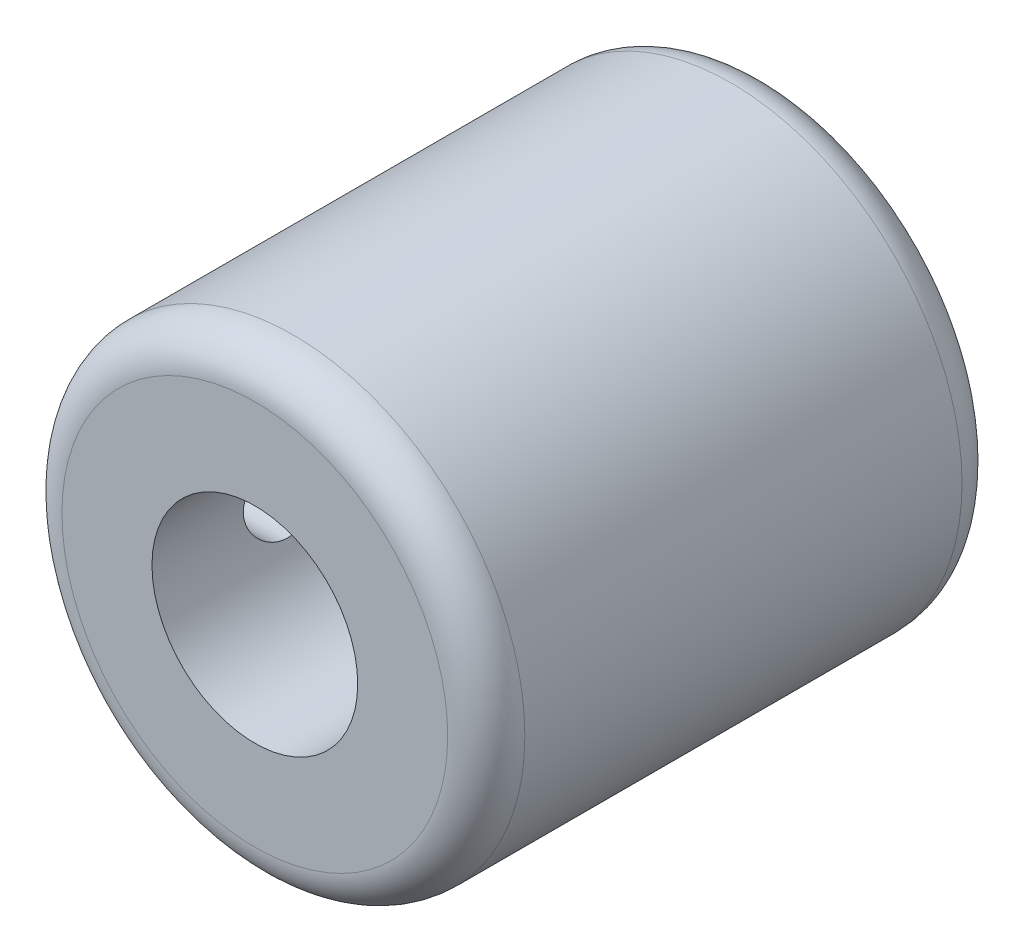
ISO-10303-21;
HEADER;
FILE_DESCRIPTION(('STEP AP214'),'2;1');
FILE_NAME('part.step','',(''),(''),'','','');
FILE_SCHEMA(('AUTOMOTIVE_DESIGN { 1 0 10303 214 1 1 1 1 }'));
ENDSEC;
DATA;
#1=APPLICATION_CONTEXT('core data for automotive mechanical design processes');
#2=APPLICATION_PROTOCOL_DEFINITION('international standard','automotive_design',2000,#1);
#3=PRODUCT_CONTEXT('',#1,'mechanical');
#4=PRODUCT('Part','Part','',(#3));
#5=PRODUCT_RELATED_PRODUCT_CATEGORY('part','',(#4));
#6=PRODUCT_DEFINITION_FORMATION('','',#4);
#7=PRODUCT_DEFINITION_CONTEXT('part definition',#1,'design');
#8=PRODUCT_DEFINITION('design','',#6,#7);
#9=PRODUCT_DEFINITION_SHAPE('','',#8);
#10=(LENGTH_UNIT() NAMED_UNIT(*) SI_UNIT(.MILLI.,.METRE.));
#11=(NAMED_UNIT(*) PLANE_ANGLE_UNIT() SI_UNIT($,.RADIAN.));
#12=(NAMED_UNIT(*) SI_UNIT($,.STERADIAN.) SOLID_ANGLE_UNIT());
#13=UNCERTAINTY_MEASURE_WITH_UNIT(LENGTH_MEASURE(1.E-05),#10,'distance_accuracy_value','');
#14=(GEOMETRIC_REPRESENTATION_CONTEXT(3) GLOBAL_UNCERTAINTY_ASSIGNED_CONTEXT((#13)) GLOBAL_UNIT_ASSIGNED_CONTEXT((#10,
#11,#12)) REPRESENTATION_CONTEXT('',''));
#15=CARTESIAN_POINT('',(0.,0.,0.));
#16=DIRECTION('',(0.,0.,1.));
#17=DIRECTION('',(1.,0.,0.));
#18=AXIS2_PLACEMENT_3D('',#15,#16,#17);
#19=CARTESIAN_POINT('',(0.,0.,20.));
#20=DIRECTION('',(0.,0.,-1.));
#21=DIRECTION('',(-1.,0.,0.));
#22=AXIS2_PLACEMENT_3D('',#19,#20,#21);
#23=CYLINDRICAL_SURFACE('',#22,9.);
#24=CARTESIAN_POINT('',(-9.,0.,16.45));
#25=CARTESIAN_POINT('',(-8.99999864163477,-0.0808856973678511,16.4499967234144));
#26=CARTESIAN_POINT('',(-8.99889820188385,-0.16181650230717,16.4432090421148));
#27=CARTESIAN_POINT('',(-8.99461427607327,-0.32141091503306,16.416247423835));
#28=CARTESIAN_POINT('',(-8.99142883568083,-0.400072323350608,16.3960609274988));
#29=CARTESIAN_POINT('',(-8.98333243334627,-0.552795622571262,16.3429247761249));
#30=CARTESIAN_POINT('',(-8.9784228463649,-0.626861123368276,16.3099852891171));
#31=CARTESIAN_POINT('',(-8.96741889784966,-0.768403758298808,16.2323042124315));
#32=CARTESIAN_POINT('',(-8.96132468180079,-0.83588169992727,16.1875640717583));
#33=CARTESIAN_POINT('',(-8.94856673883706,-0.962948382041984,16.0871250823013));
#34=CARTESIAN_POINT('',(-8.9418988381795,-1.02246954424322,16.0313412604147));
#35=CARTESIAN_POINT('',(-8.92877723275232,-1.13134956927619,15.9105812988802));
#36=CARTESIAN_POINT('',(-8.92232354109868,-1.18070781079303,15.8456045976309));
#37=CARTESIAN_POINT('',(-8.91032062687366,-1.26812908144997,15.7078425636774));
#38=CARTESIAN_POINT('',(-8.90477679815245,-1.30612577634167,15.6350146255892));
#39=CARTESIAN_POINT('',(-8.89527890726653,-1.36932126901981,15.4839058843686));
#40=CARTESIAN_POINT('',(-8.89132474492389,-1.39452087328237,15.4056254252093));
#41=CARTESIAN_POINT('',(-8.88549527203013,-1.43119497399203,15.2465482096227));
#42=CARTESIAN_POINT('',(-8.88360234985213,-1.44278581414223,15.1657789328401));
#43=CARTESIAN_POINT('',(-8.8820563424505,-1.45227398597368,15.0034214036398));
#44=CARTESIAN_POINT('',(-8.88240310906642,-1.45017222345115,14.921833205752));
#45=CARTESIAN_POINT('',(-8.88528121037884,-1.43242972412222,14.7609813508911));
#46=CARTESIAN_POINT('',(-8.88779151853046,-1.41691929604864,14.6817028896378));
#47=CARTESIAN_POINT('',(-8.89468096456813,-1.37300407180315,14.5268884917858));
#48=CARTESIAN_POINT('',(-8.8990601627026,-1.34459885993321,14.4513526759284));
#49=CARTESIAN_POINT('',(-8.90921685418146,-1.27556710019612,14.3057754577108));
#50=CARTESIAN_POINT('',(-8.91500055833395,-1.23488606848857,14.2357603423395));
#51=CARTESIAN_POINT('',(-8.9273102129522,-1.14249617763678,14.1035007691039));
#52=CARTESIAN_POINT('',(-8.93383621946084,-1.09078648558467,14.0412568987039));
#53=CARTESIAN_POINT('',(-8.94698773076978,-0.97709530918945,13.9255520775868));
#54=CARTESIAN_POINT('',(-8.95361351338075,-0.915001940862879,13.8722010341061));
#55=CARTESIAN_POINT('',(-8.96614813756879,-0.782685420070307,13.7766593221192));
#56=CARTESIAN_POINT('',(-8.97205697507047,-0.712462221395637,13.7344687170517));
#57=CARTESIAN_POINT('',(-8.9824995419863,-0.565778862672475,13.6624370215559));
#58=CARTESIAN_POINT('',(-8.98703223682215,-0.489314064742303,13.63260521631));
#59=CARTESIAN_POINT('',(-8.9942033907472,-0.332370368449597,13.5862377057025));
#60=CARTESIAN_POINT('',(-8.99684199778982,-0.251891784142397,13.569700961808));
#61=CARTESIAN_POINT('',(-8.999907885314,-0.0901527434475038,13.5505410025793));
#62=CARTESIAN_POINT('',(-9.0003591564028,-0.00891060812457383,13.5477668319632));
#63=CARTESIAN_POINT('',(-8.99906509532078,0.152877988086238,13.5558089253652));
#64=CARTESIAN_POINT('',(-8.99731984194801,0.233424473825466,13.5666247018579));
#65=CARTESIAN_POINT('',(-8.99184367572178,0.391072188867863,13.6014141197314));
#66=CARTESIAN_POINT('',(-8.98812398290452,0.468190243474585,13.6253134358321));
#67=CARTESIAN_POINT('',(-8.97911444477738,0.617324972735383,13.6855125803072));
#68=CARTESIAN_POINT('',(-8.97382451615702,0.689341376464934,13.7218130666539));
#69=CARTESIAN_POINT('',(-8.96220213122442,0.826887014248267,13.8061327443032));
#70=CARTESIAN_POINT('',(-8.95586138334354,0.892357419344897,13.8542467351865));
#71=CARTESIAN_POINT('',(-8.9428668457303,1.01434858455788,13.9606966946547));
#72=CARTESIAN_POINT('',(-8.93621303486055,1.07086873924296,14.0190333541808));
#73=CARTESIAN_POINT('',(-8.92326523772599,1.17391103158434,14.144948024981));
#74=CARTESIAN_POINT('',(-8.91697534238602,1.22033144783826,14.2126097661866));
#75=CARTESIAN_POINT('',(-8.90554257529543,1.30114730089955,14.3548592848618));
#76=CARTESIAN_POINT('',(-8.90039966895978,1.33554310030165,14.4294468534017));
#77=CARTESIAN_POINT('',(-8.89187351088456,1.3911793025898,14.5831398355927));
#78=CARTESIAN_POINT('',(-8.88848336189528,1.41247133391358,14.6622261601934));
#79=CARTESIAN_POINT('',(-8.88382890168131,1.44145873215248,14.8229115492917));
#80=CARTESIAN_POINT('',(-8.8825644188798,1.44915519645986,14.9045104104441));
#81=CARTESIAN_POINT('',(-8.88231151925494,1.45070392455937,15.0668894935775));
#82=CARTESIAN_POINT('',(-8.88329678925587,1.44471623787208,15.1476681930062));
#83=CARTESIAN_POINT('',(-8.88737487767908,1.41941164318997,15.3070531292623));
#84=CARTESIAN_POINT('',(-8.89046769052655,1.40009477045306,15.3856593718356));
#85=CARTESIAN_POINT('',(-8.89840265721008,1.34873984861123,15.5384121850153));
#86=CARTESIAN_POINT('',(-8.90324303796602,1.31671469006408,15.6125631872757));
#87=CARTESIAN_POINT('',(-8.91412961190141,1.24086851755459,15.754465757622));
#88=CARTESIAN_POINT('',(-8.92017585841292,1.19704698184172,15.8222170424711));
#89=CARTESIAN_POINT('',(-8.93287673735512,1.0982772134197,15.9502071827237));
#90=CARTESIAN_POINT('',(-8.93953737432156,1.04321095049667,16.0103543707792));
#91=CARTESIAN_POINT('',(-8.95266789166719,0.923764066193614,16.1206100315024));
#92=CARTESIAN_POINT('',(-8.9591377275746,0.85938129366334,16.1707161793384));
#93=CARTESIAN_POINT('',(-8.97120553613006,0.722639750859131,16.2597590227405));
#94=CARTESIAN_POINT('',(-8.97679765153614,0.650232479097537,16.298622029143));
#95=CARTESIAN_POINT('',(-8.98642284134844,0.499858635602067,16.3635745167051));
#96=CARTESIAN_POINT('',(-8.99045748906061,0.421897768767407,16.3896768953992));
#97=CARTESIAN_POINT('',(-8.99561866396827,0.286347832230083,16.4226129534629));
#98=CARTESIAN_POINT('',(-8.99725300228573,0.229584761453284,16.4328669097724));
#99=CARTESIAN_POINT('',(-8.99944414581359,0.115222082591752,16.4465615474572));
#100=CARTESIAN_POINT('',(-9.00000096769127,0.0576224874604517,16.45000233422));
#101=CARTESIAN_POINT('',(-9.,0.,16.45));
#102=B_SPLINE_CURVE_WITH_KNOTS('',3,(#24,#25,#26,#27,#28,#29,#30,#31,#32,#33,#34,#35,#36,#37,
#38,#39,#40,#41,#42,#43,#44,#45,#46,#47,#48,#49,#50,#51,#52,#53,#54,#55,#56,#57,#58,#59,#60,#61,
#62,#63,#64,#65,#66,#67,#68,#69,#70,#71,#72,#73,#74,#75,#76,#77,#78,#79,#80,#81,#82,#83,#84,#85,
#86,#87,#88,#89,#90,#91,#92,#93,#94,#95,#96,#97,#98,#99,#100,#101),.UNSPECIFIED.,.T.,.F.,(4,2,2,
2,2,2,2,2,2,2,2,2,2,2,2,2,2,2,2,2,2,2,2,2,2,2,2,2,2,2,2,2,2,2,2,2,2,2,4),(0.,0.242446488977203,
0.485120556285424,0.727601535351912,0.970052753977688,1.2144475309955,1.45885724476857,
1.70466726356049,1.95046178941548,2.19413931011527,2.43780071116677,2.67912043486191,
2.92044793869997,3.16286268760828,3.40529575068037,3.65053273475498,3.89577111278622,
4.14119340605037,4.38659652648823,4.62930188944318,4.87199854584075,5.11333058050704,
5.35467542158252,5.59802418626105,5.84138940501288,6.08710259860975,6.33280838224111,
6.57753978919831,6.82225144128799,7.06411562003958,7.30597915902277,7.5475979900289,
7.78922750952613,8.03353728745573,8.27790356595643,8.52383693999697,8.76952122549928,
8.94224132716647,9.1149587571391),.UNSPECIFIED.);
#103=CARTESIAN_POINT('',(-9.,0.,16.45));
#104=VERTEX_POINT('',#103);
#105=EDGE_CURVE('E9',#104,#104,#102,.T.);
#106=ORIENTED_EDGE('',*,*,#105,.T.);
#107=EDGE_LOOP('',(#106));
#108=FACE_BOUND('',#107,.T.);
#109=CARTESIAN_POINT('',(0.,0.,1.5));
#110=DIRECTION('',(0.,0.,1.));
#111=DIRECTION('',(1.,0.,0.));
#112=AXIS2_PLACEMENT_3D('',#109,#110,#111);
#113=CIRCLE('',#112,9.);
#114=CARTESIAN_POINT('',(9.,0.,1.5));
#115=VERTEX_POINT('',#114);
#116=EDGE_CURVE('E26',#115,#115,#113,.T.);
#117=ORIENTED_EDGE('',*,*,#116,.T.);
#118=EDGE_LOOP('',(#117));
#119=FACE_BOUND('',#118,.T.);
#120=CARTESIAN_POINT('',(0.,0.,18.5));
#121=DIRECTION('',(0.,0.,1.));
#122=DIRECTION('',(1.,0.,0.));
#123=AXIS2_PLACEMENT_3D('',#120,#121,#122);
#124=CIRCLE('',#123,9.);
#125=CARTESIAN_POINT('',(9.,0.,18.5));
#126=VERTEX_POINT('',#125);
#127=EDGE_CURVE('E32',#126,#126,#124,.F.);
#128=ORIENTED_EDGE('',*,*,#127,.T.);
#129=EDGE_LOOP('',(#128));
#130=FACE_BOUND('',#129,.T.);
#131=ADVANCED_FACE('F14',(#108,#119,#130),#23,.T.);
#132=CARTESIAN_POINT('',(0.,0.,20.));
#133=DIRECTION('',(0.,0.,1.));
#134=DIRECTION('',(1.,0.,0.));
#135=AXIS2_PLACEMENT_3D('',#132,#133,#134);
#136=PLANE('',#135);
#137=CARTESIAN_POINT('',(0.,0.,20.));
#138=DIRECTION('',(0.,0.,1.));
#139=DIRECTION('',(1.,0.,0.));
#140=AXIS2_PLACEMENT_3D('',#137,#138,#139);
#141=CIRCLE('',#140,7.5);
#142=CARTESIAN_POINT('',(7.5,0.,20.));
#143=VERTEX_POINT('',#142);
#144=EDGE_CURVE('E37',#143,#143,#141,.T.);
#145=ORIENTED_EDGE('',*,*,#144,.T.);
#146=EDGE_LOOP('',(#145));
#147=FACE_BOUND('',#146,.T.);
#148=CARTESIAN_POINT('',(0.,0.,20.));
#149=DIRECTION('',(0.,0.,1.));
#150=DIRECTION('',(1.,0.,0.));
#151=AXIS2_PLACEMENT_3D('',#148,#149,#150);
#152=CIRCLE('',#151,4.);
#153=CARTESIAN_POINT('',(4.,0.,20.));
#154=VERTEX_POINT('',#153);
#155=EDGE_CURVE('E43',#154,#154,#152,.T.);
#156=ORIENTED_EDGE('',*,*,#155,.F.);
#157=EDGE_LOOP('',(#156));
#158=FACE_BOUND('',#157,.T.);
#159=ADVANCED_FACE('F77',(#147,#158),#136,.T.);
#160=CARTESIAN_POINT('',(0.,0.,0.));
#161=DIRECTION('',(0.,0.,1.));
#162=DIRECTION('',(1.,0.,0.));
#163=AXIS2_PLACEMENT_3D('',#160,#161,#162);
#164=PLANE('',#163);
#165=CARTESIAN_POINT('',(0.,0.,0.));
#166=DIRECTION('',(0.,0.,1.));
#167=DIRECTION('',(1.,0.,0.));
#168=AXIS2_PLACEMENT_3D('',#165,#166,#167);
#169=CIRCLE('',#168,7.5);
#170=CARTESIAN_POINT('',(7.5,0.,0.));
#171=VERTEX_POINT('',#170);
#172=EDGE_CURVE('E47',#171,#171,#169,.F.);
#173=ORIENTED_EDGE('',*,*,#172,.T.);
#174=EDGE_LOOP('',(#173));
#175=FACE_BOUND('',#174,.T.);
#176=ADVANCED_FACE('F81',(#175),#164,.F.);
#177=CARTESIAN_POINT('',(0.,0.,10.));
#178=DIRECTION('',(0.,0.,1.));
#179=DIRECTION('',(1.,0.,0.));
#180=AXIS2_PLACEMENT_3D('',#177,#178,#179);
#181=CYLINDRICAL_SURFACE('',#180,4.);
#182=CARTESIAN_POINT('',(4.,0.,13.55));
#183=CARTESIAN_POINT('',(4.00000143429507,0.0787102188966314,13.5499980327237));
#184=CARTESIAN_POINT('',(3.99765615873192,0.157406560614781,13.5564292482891));
#185=CARTESIAN_POINT('',(3.98853365231903,0.312457571109631,13.58188808274));
#186=CARTESIAN_POINT('',(3.98175673206563,0.388812403600805,13.6009148188567));
#187=CARTESIAN_POINT('',(3.96450118916375,0.536922462366696,13.6508102738149));
#188=CARTESIAN_POINT('',(3.95402941917063,0.608685914938118,13.6816570796047));
#189=CARTESIAN_POINT('',(3.93043508700044,0.746016803327517,13.7542094318718));
#190=CARTESIAN_POINT('',(3.91731186630476,0.811582693959306,13.7959176766588));
#191=CARTESIAN_POINT('',(3.88918970877766,0.937285118452878,13.8907580494355));
#192=CARTESIAN_POINT('',(3.87414013213587,0.997139891199243,13.9442484858298));
#193=CARTESIAN_POINT('',(3.84411947833009,1.10725279772525,14.0603740029828));
#194=CARTESIAN_POINT('',(3.82914842408005,1.1575082669946,14.1230116142644));
#195=CARTESIAN_POINT('',(3.80040087939939,1.24872957377567,14.2583385895047));
#196=CARTESIAN_POINT('',(3.78668477591321,1.2893073542514,14.3313036332209));
#197=CARTESIAN_POINT('',(3.76278248881608,1.35749147076301,14.4835989089086));
#198=CARTESIAN_POINT('',(3.75259500060563,1.38510260217424,14.5629267750294));
#199=CARTESIAN_POINT('',(3.73744223418718,1.425474306903,14.7224627453627));
#200=CARTESIAN_POINT('',(3.73228956305749,1.43876982416805,14.8025171017444));
#201=CARTESIAN_POINT('',(3.72723946304291,1.45180567304114,14.9638736111432));
#202=CARTESIAN_POINT('',(3.72734004250361,1.45155114185128,15.0451752795824));
#203=CARTESIAN_POINT('',(3.73262267409551,1.43790508960839,15.2019322401092));
#204=CARTESIAN_POINT('',(3.73752322645273,1.42524130526234,15.2774620935264));
#205=CARTESIAN_POINT('',(3.75138804868882,1.38833434277266,15.4252413100427));
#206=CARTESIAN_POINT('',(3.76035289019221,1.36408953578306,15.4974902101169));
#207=CARTESIAN_POINT('',(3.78151508931447,1.30428590365613,15.6381921734249));
#208=CARTESIAN_POINT('',(3.79376804732004,1.26853013421168,15.7065527990085));
#209=CARTESIAN_POINT('',(3.82010587581947,1.18685657265191,15.8365207969096));
#210=CARTESIAN_POINT('',(3.83419134797484,1.14093543949723,15.8981259389316));
#211=CARTESIAN_POINT('',(3.8636813461966,1.03685380399282,16.0168823285497));
#212=CARTESIAN_POINT('',(3.87911330363703,0.978107895512866,16.0735148898613));
#213=CARTESIAN_POINT('',(3.90879691295878,0.851770367366752,16.1762729986214));
#214=CARTESIAN_POINT('',(3.92304840628929,0.784177562589422,16.2223971361111));
#215=CARTESIAN_POINT('',(3.9490165022621,0.640811853190591,16.3033515258444));
#216=CARTESIAN_POINT('',(3.96069598677122,0.564940184547808,16.3380196172229));
#217=CARTESIAN_POINT('',(3.97993087107474,0.407913924152249,16.3939311306713));
#218=CARTESIAN_POINT('',(3.98748797738855,0.326761534028099,16.4151801083571));
#219=CARTESIAN_POINT('',(3.99733199343639,0.165850881119847,16.4426775684794));
#220=CARTESIAN_POINT('',(3.99986431835224,0.086226984063093,16.4496252295282));
#221=CARTESIAN_POINT('',(4.00012487803513,-0.0730793807824145,16.4503449671725));
#222=CARTESIAN_POINT('',(3.99785409609124,-0.152761833245371,16.4441197405132));
#223=CARTESIAN_POINT('',(3.98892574075719,-0.306971769665556,16.4192092040065));
#224=CARTESIAN_POINT('',(3.98242634268282,-0.381581880655493,16.4009728879694));
#225=CARTESIAN_POINT('',(3.96585246772161,-0.526638331560443,16.3531396817656));
#226=CARTESIAN_POINT('',(3.95577752595712,-0.597084128658265,16.3235413143102));
#227=CARTESIAN_POINT('',(3.93269799287489,-0.734065013482935,16.2528993991782));
#228=CARTESIAN_POINT('',(3.91961788794789,-0.800430745978938,16.2115528683167));
#229=CARTESIAN_POINT('',(3.89198705575026,-0.925497470523081,16.1189345902305));
#230=CARTESIAN_POINT('',(3.87743581293794,-0.98419575898049,16.0676593578161));
#231=CARTESIAN_POINT('',(3.84749418794681,-1.09557971967385,15.9533679695239));
#232=CARTESIAN_POINT('',(3.83210101740911,-1.14776796846998,15.8898665312232));
#233=CARTESIAN_POINT('',(3.80298761939568,-1.24083444907402,15.7546937415631));
#234=CARTESIAN_POINT('',(3.78926749248274,-1.28171200120929,15.6830218996));
#235=CARTESIAN_POINT('',(3.76514010385446,-1.35095316988891,15.5331500076326));
#236=CARTESIAN_POINT('',(3.75473924877079,-1.37929262648283,15.4549376963147));
#237=CARTESIAN_POINT('',(3.73868905158302,-1.42223058341667,15.294373796911));
#238=CARTESIAN_POINT('',(3.73303702926072,-1.43683683526581,15.2120245715328));
#239=CARTESIAN_POINT('',(3.72746504538524,-1.45122640814098,15.0508739973767));
#240=CARTESIAN_POINT('',(3.7272198640188,-1.45185077279354,14.9721583024371));
#241=CARTESIAN_POINT('',(3.73166466892373,-1.44038737859731,14.8158075591342));
#242=CARTESIAN_POINT('',(3.73635424771032,-1.42830066935765,14.7381724220808));
#243=CARTESIAN_POINT('',(3.7498778663344,-1.39239595048803,14.5882738229403));
#244=CARTESIAN_POINT('',(3.75859821711893,-1.36889890664495,14.515922369653));
#245=CARTESIAN_POINT('',(3.7791416909213,-1.31111547378809,14.3761412953731));
#246=CARTESIAN_POINT('',(3.79096557226788,-1.27682644741103,14.3087128824493));
#247=CARTESIAN_POINT('',(3.81711771948606,-1.19644513556003,14.177040847293));
#248=CARTESIAN_POINT('',(3.83154144962498,-1.14984964568512,14.1131235727399));
#249=CARTESIAN_POINT('',(3.86091879905902,-1.04697882292615,13.9937455069048));
#250=CARTESIAN_POINT('',(3.87587257990627,-0.990700518358097,13.9382873216285));
#251=CARTESIAN_POINT('',(3.90550898759357,-0.86674652175497,13.8346282178496));
#252=CARTESIAN_POINT('',(3.92014206041408,-0.798646255585548,13.786918714423));
#253=CARTESIAN_POINT('',(3.94670230500472,-0.654887277166565,13.7036510176979));
#254=CARTESIAN_POINT('',(3.95862956169156,-0.579228802223843,13.6680924430486));
#255=CARTESIAN_POINT('',(3.97857109220645,-0.421194621236151,13.6099313342799));
#256=CARTESIAN_POINT('',(3.9865209681141,-0.338732079278771,13.5875410540631));
#257=CARTESIAN_POINT('',(3.99723355206214,-0.170840068367134,13.557579573305));
#258=CARTESIAN_POINT('',(3.99999844358436,-0.0854118637456353,13.5500021347766));
#259=CARTESIAN_POINT('',(4.,0.,13.55));
#260=B_SPLINE_CURVE_WITH_KNOTS('',3,(#182,#183,#184,#185,#186,#187,#188,#189,#190,#191,#192,
#193,#194,#195,#196,#197,#198,#199,#200,#201,#202,#203,#204,#205,#206,#207,#208,#209,#210,#211,
#212,#213,#214,#215,#216,#217,#218,#219,#220,#221,#222,#223,#224,#225,#226,#227,#228,#229,#230,
#231,#232,#233,#234,#235,#236,#237,#238,#239,#240,#241,#242,#243,#244,#245,#246,#247,#248,#249,
#250,#251,#252,#253,#254,#255,#256,#257,#258,#259),.UNSPECIFIED.,.T.,.F.,(4,2,2,2,2,2,2,2,2,2,2,
2,2,2,2,2,2,2,2,2,2,2,2,2,2,2,2,2,2,2,2,2,2,2,2,2,2,2,4),(0.,0.235815830831915,
0.471615136041737,0.706979394974231,0.942402181373603,1.18633103053023,1.43032748974056,
1.68288966606067,1.93535836517963,2.1780251356637,2.42059990504772,2.649751394059,
2.87893512222928,3.11226934704534,3.34568037574031,3.59367330938504,3.84169949769454,
4.09309949254546,4.34439533752192,4.58308195035428,4.82171970414026,5.05190772695764,
5.28212568885753,5.51892461059925,5.7558068050806,6.00551088108394,6.25522995883232,
6.50542815237801,6.75548504023685,6.99045716940954,7.22540989742577,7.45410602635347,
7.68285808788839,7.92301401090676,8.16324377037926,8.41529497370846,8.6673382658131,
8.92334005666778,9.17923401674596),.UNSPECIFIED.);
#261=CARTESIAN_POINT('',(4.,0.,13.55));
#262=VERTEX_POINT('',#261);
#263=EDGE_CURVE('E51',#262,#262,#260,.T.);
#264=ORIENTED_EDGE('',*,*,#263,.T.);
#265=EDGE_LOOP('',(#264));
#266=FACE_BOUND('',#265,.T.);
#267=CARTESIAN_POINT('',(-4.,0.,13.55));
#268=CARTESIAN_POINT('',(-4.00000143429507,-0.0787102188966308,13.5499980327237));
#269=CARTESIAN_POINT('',(-3.99765615873192,-0.15740656061478,13.5564292482891));
#270=CARTESIAN_POINT('',(-3.98853365231903,-0.31245757110963,13.58188808274));
#271=CARTESIAN_POINT('',(-3.98175673206563,-0.388812403600804,13.6009148188567));
#272=CARTESIAN_POINT('',(-3.96450118916375,-0.536922462366696,13.6508102738149));
#273=CARTESIAN_POINT('',(-3.95402941917063,-0.608685914938118,13.6816570796047));
#274=CARTESIAN_POINT('',(-3.93043508700044,-0.746016803327518,13.7542094318718));
#275=CARTESIAN_POINT('',(-3.91731186630476,-0.811582693959306,13.7959176766588));
#276=CARTESIAN_POINT('',(-3.88918970877766,-0.937285118452878,13.8907580494355));
#277=CARTESIAN_POINT('',(-3.87414013213587,-0.997139891199243,13.9442484858298));
#278=CARTESIAN_POINT('',(-3.84411947833009,-1.10725279772525,14.0603740029828));
#279=CARTESIAN_POINT('',(-3.82914842408005,-1.1575082669946,14.1230116142644));
#280=CARTESIAN_POINT('',(-3.80040087939939,-1.24872957377567,14.2583385895047));
#281=CARTESIAN_POINT('',(-3.78668477591321,-1.2893073542514,14.3313036332209));
#282=CARTESIAN_POINT('',(-3.76278248881607,-1.35749147076301,14.4835989089086));
#283=CARTESIAN_POINT('',(-3.75259500060563,-1.38510260217424,14.5629267750294));
#284=CARTESIAN_POINT('',(-3.73744223418718,-1.425474306903,14.7224627453627));
#285=CARTESIAN_POINT('',(-3.73228956305749,-1.43876982416805,14.8025171017444));
#286=CARTESIAN_POINT('',(-3.72723946304291,-1.45180567304114,14.9638736111432));
#287=CARTESIAN_POINT('',(-3.72734004250361,-1.45155114185128,15.0451752795824));
#288=CARTESIAN_POINT('',(-3.73262267409551,-1.43790508960839,15.2019322401092));
#289=CARTESIAN_POINT('',(-3.73752322645273,-1.42524130526234,15.2774620935264));
#290=CARTESIAN_POINT('',(-3.75138804868882,-1.38833434277266,15.4252413100427));
#291=CARTESIAN_POINT('',(-3.7603528901922,-1.36408953578306,15.4974902101169));
#292=CARTESIAN_POINT('',(-3.78151508931447,-1.30428590365613,15.6381921734249));
#293=CARTESIAN_POINT('',(-3.79376804732004,-1.26853013421168,15.7065527990085));
#294=CARTESIAN_POINT('',(-3.82010587581947,-1.18685657265191,15.8365207969096));
#295=CARTESIAN_POINT('',(-3.83419134797485,-1.14093543949723,15.8981259389316));
#296=CARTESIAN_POINT('',(-3.8636813461966,-1.03685380399282,16.0168823285497));
#297=CARTESIAN_POINT('',(-3.87911330363703,-0.978107895512866,16.0735148898613));
#298=CARTESIAN_POINT('',(-3.90879691295878,-0.851770367366752,16.1762729986214));
#299=CARTESIAN_POINT('',(-3.92304840628929,-0.784177562589422,16.2223971361111));
#300=CARTESIAN_POINT('',(-3.9490165022621,-0.640811853190591,16.3033515258444));
#301=CARTESIAN_POINT('',(-3.96069598677122,-0.564940184547809,16.3380196172229));
#302=CARTESIAN_POINT('',(-3.97993087107474,-0.40791392415225,16.3939311306713));
#303=CARTESIAN_POINT('',(-3.98748797738855,-0.326761534028101,16.4151801083571));
#304=CARTESIAN_POINT('',(-3.99733199343639,-0.165850881119849,16.4426775684794));
#305=CARTESIAN_POINT('',(-3.99986431835224,-0.086226984063095,16.4496252295282));
#306=CARTESIAN_POINT('',(-4.00012487803513,0.0730793807824129,16.4503449671725));
#307=CARTESIAN_POINT('',(-3.99785409609124,0.15276183324537,16.4441197405132));
#308=CARTESIAN_POINT('',(-3.98892574075719,0.306971769665555,16.4192092040065));
#309=CARTESIAN_POINT('',(-3.98242634268282,0.381581880655492,16.4009728879694));
#310=CARTESIAN_POINT('',(-3.96585246772161,0.526638331560442,16.3531396817656));
#311=CARTESIAN_POINT('',(-3.95577752595712,0.597084128658264,16.3235413143102));
#312=CARTESIAN_POINT('',(-3.93269799287489,0.734065013482934,16.2528993991782));
#313=CARTESIAN_POINT('',(-3.91961788794789,0.800430745978937,16.2115528683167));
#314=CARTESIAN_POINT('',(-3.89198705575026,0.925497470523079,16.1189345902305));
#315=CARTESIAN_POINT('',(-3.87743581293794,0.984195758980488,16.0676593578161));
#316=CARTESIAN_POINT('',(-3.84749418794681,1.09557971967385,15.9533679695239));
#317=CARTESIAN_POINT('',(-3.83210101740911,1.14776796846998,15.8898665312232));
#318=CARTESIAN_POINT('',(-3.80298761939568,1.24083444907402,15.7546937415631));
#319=CARTESIAN_POINT('',(-3.78926749248274,1.28171200120929,15.6830218996));
#320=CARTESIAN_POINT('',(-3.76514010385446,1.35095316988891,15.5331500076326));
#321=CARTESIAN_POINT('',(-3.75473924877079,1.37929262648283,15.4549376963147));
#322=CARTESIAN_POINT('',(-3.73868905158302,1.42223058341667,15.294373796911));
#323=CARTESIAN_POINT('',(-3.73303702926072,1.43683683526581,15.2120245715328));
#324=CARTESIAN_POINT('',(-3.72746504538524,1.45122640814098,15.0508739973767));
#325=CARTESIAN_POINT('',(-3.7272198640188,1.45185077279354,14.9721583024371));
#326=CARTESIAN_POINT('',(-3.73166466892373,1.44038737859731,14.8158075591342));
#327=CARTESIAN_POINT('',(-3.73635424771032,1.42830066935765,14.7381724220808));
#328=CARTESIAN_POINT('',(-3.7498778663344,1.39239595048804,14.5882738229403));
#329=CARTESIAN_POINT('',(-3.75859821711893,1.36889890664495,14.515922369653));
#330=CARTESIAN_POINT('',(-3.7791416909213,1.31111547378809,14.3761412953731));
#331=CARTESIAN_POINT('',(-3.79096557226789,1.27682644741103,14.3087128824493));
#332=CARTESIAN_POINT('',(-3.81711771948606,1.19644513556003,14.177040847293));
#333=CARTESIAN_POINT('',(-3.83154144962498,1.14984964568512,14.1131235727399));
#334=CARTESIAN_POINT('',(-3.86091879905902,1.04697882292615,13.9937455069048));
#335=CARTESIAN_POINT('',(-3.87587257990627,0.990700518358097,13.9382873216285));
#336=CARTESIAN_POINT('',(-3.90550898759357,0.86674652175497,13.8346282178496));
#337=CARTESIAN_POINT('',(-3.92014206041408,0.798646255585548,13.786918714423));
#338=CARTESIAN_POINT('',(-3.94670230500472,0.654887277166565,13.7036510176979));
#339=CARTESIAN_POINT('',(-3.95862956169156,0.579228802223843,13.6680924430486));
#340=CARTESIAN_POINT('',(-3.97857109220645,0.421194621236152,13.6099313342799));
#341=CARTESIAN_POINT('',(-3.9865209681141,0.338732079278771,13.5875410540631));
#342=CARTESIAN_POINT('',(-3.99723355206214,0.170840068367134,13.557579573305));
#343=CARTESIAN_POINT('',(-3.99999844358436,0.0854118637456357,13.5500021347766));
#344=CARTESIAN_POINT('',(-4.,0.,13.55));
#345=B_SPLINE_CURVE_WITH_KNOTS('',3,(#267,#268,#269,#270,#271,#272,#273,#274,#275,#276,#277,
#278,#279,#280,#281,#282,#283,#284,#285,#286,#287,#288,#289,#290,#291,#292,#293,#294,#295,#296,
#297,#298,#299,#300,#301,#302,#303,#304,#305,#306,#307,#308,#309,#310,#311,#312,#313,#314,#315,
#316,#317,#318,#319,#320,#321,#322,#323,#324,#325,#326,#327,#328,#329,#330,#331,#332,#333,#334,
#335,#336,#337,#338,#339,#340,#341,#342,#343,#344),.UNSPECIFIED.,.T.,.F.,(4,2,2,2,2,2,2,2,2,2,2,
2,2,2,2,2,2,2,2,2,2,2,2,2,2,2,2,2,2,2,2,2,2,2,2,2,2,2,4),(0.,0.235815830831915,
0.471615136041737,0.706979394974232,0.942402181373603,1.18633103053024,1.43032748974056,
1.68288966606067,1.93535836517963,2.1780251356637,2.42059990504772,2.649751394059,
2.87893512222928,3.11226934704534,3.34568037574031,3.59367330938504,3.84169949769454,
4.09309949254545,4.34439533752192,4.58308195035428,4.82171970414026,5.05190772695764,
5.28212568885753,5.51892461059925,5.7558068050806,6.00551088108394,6.25522995883232,
6.50542815237801,6.75548504023685,6.99045716940954,7.22540989742577,7.45410602635347,
7.68285808788839,7.92301401090676,8.16324377037925,8.41529497370846,8.6673382658131,
8.92334005666778,9.17923401674596),.UNSPECIFIED.);
#346=CARTESIAN_POINT('',(-4.,0.,13.55));
#347=VERTEX_POINT('',#346);
#348=EDGE_CURVE('E60',#347,#347,#345,.T.);
#349=ORIENTED_EDGE('',*,*,#348,.T.);
#350=EDGE_LOOP('',(#349));
#351=FACE_BOUND('',#350,.T.);
#352=CARTESIAN_POINT('',(0.,0.,10.));
#353=DIRECTION('',(0.,0.,1.));
#354=DIRECTION('',(1.,0.,0.));
#355=AXIS2_PLACEMENT_3D('',#352,#353,#354);
#356=CIRCLE('',#355,4.);
#357=CARTESIAN_POINT('',(4.,0.,10.));
#358=VERTEX_POINT('',#357);
#359=EDGE_CURVE('E116',#358,#358,#356,.T.);
#360=ORIENTED_EDGE('',*,*,#359,.F.);
#361=EDGE_LOOP('',(#360));
#362=FACE_BOUND('',#361,.T.);
#363=ORIENTED_EDGE('',*,*,#155,.T.);
#364=EDGE_LOOP('',(#363));
#365=FACE_BOUND('',#364,.T.);
#366=ADVANCED_FACE('F66',(#266,#351,#362,#365),#181,.F.);
#367=CARTESIAN_POINT('',(0.,0.,10.));
#368=DIRECTION('',(0.,0.,1.));
#369=DIRECTION('',(1.,0.,0.));
#370=AXIS2_PLACEMENT_3D('',#367,#368,#369);
#371=PLANE('',#370);
#372=ORIENTED_EDGE('',*,*,#359,.T.);
#373=EDGE_LOOP('',(#372));
#374=FACE_BOUND('',#373,.T.);
#375=ADVANCED_FACE('F88',(#374),#371,.T.);
#376=CARTESIAN_POINT('',(0.,0.,1.5));
#377=DIRECTION('',(0.,0.,1.));
#378=DIRECTION('',(1.,0.,0.));
#379=AXIS2_PLACEMENT_3D('',#376,#377,#378);
#380=TOROIDAL_SURFACE('',#379,7.5,1.5);
#381=ORIENTED_EDGE('',*,*,#172,.F.);
#382=EDGE_LOOP('',(#381));
#383=FACE_BOUND('',#382,.T.);
#384=ORIENTED_EDGE('',*,*,#116,.F.);
#385=EDGE_LOOP('',(#384));
#386=FACE_BOUND('',#385,.T.);
#387=ADVANCED_FACE('F98',(#383,#386),#380,.T.);
#388=CARTESIAN_POINT('',(0.,0.,18.5));
#389=DIRECTION('',(0.,0.,1.));
#390=DIRECTION('',(1.,0.,0.));
#391=AXIS2_PLACEMENT_3D('',#388,#389,#390);
#392=TOROIDAL_SURFACE('',#391,7.5,1.5);
#393=ORIENTED_EDGE('',*,*,#127,.F.);
#394=EDGE_LOOP('',(#393));
#395=FACE_BOUND('',#394,.T.);
#396=ORIENTED_EDGE('',*,*,#144,.F.);
#397=EDGE_LOOP('',(#396));
#398=FACE_BOUND('',#397,.T.);
#399=ADVANCED_FACE('F95',(#395,#398),#392,.T.);
#400=CARTESIAN_POINT('',(-25.3828281124773,0.,15.));
#401=DIRECTION('',(1.,0.,0.));
#402=DIRECTION('',(0.,0.,-1.));
#403=AXIS2_PLACEMENT_3D('',#400,#401,#402);
#404=CYLINDRICAL_SURFACE('',#403,1.45);
#405=ORIENTED_EDGE('',*,*,#348,.F.);
#406=EDGE_LOOP('',(#405));
#407=FACE_BOUND('',#406,.T.);
#408=ORIENTED_EDGE('',*,*,#105,.F.);
#409=EDGE_LOOP('',(#408));
#410=FACE_BOUND('',#409,.T.);
#411=ADVANCED_FACE('F75',(#407,#410),#404,.F.);
#412=CARTESIAN_POINT('',(7.,0.,15.));
#413=DIRECTION('',(1.,0.,0.));
#414=DIRECTION('',(0.,0.,-1.));
#415=AXIS2_PLACEMENT_3D('',#412,#413,#414);
#416=CIRCLE('',#415,1.45);
#417=CARTESIAN_POINT('',(7.,0.,13.55));
#418=VERTEX_POINT('',#417);
#419=EDGE_CURVE('E119',#418,#418,#416,.T.);
#420=ORIENTED_EDGE('',*,*,#419,.T.);
#421=EDGE_LOOP('',(#420));
#422=FACE_BOUND('',#421,.T.);
#423=ORIENTED_EDGE('',*,*,#263,.F.);
#424=EDGE_LOOP('',(#423));
#425=FACE_BOUND('',#424,.T.);
#426=ADVANCED_FACE('F70',(#422,#425),#404,.F.);
#427=CARTESIAN_POINT('',(7.,0.,8.225));
#428=DIRECTION('',(1.,0.,0.));
#429=DIRECTION('',(0.,1.,0.));
#430=AXIS2_PLACEMENT_3D('',#427,#428,#429);
#431=PLANE('',#430);
#432=ORIENTED_EDGE('',*,*,#419,.F.);
#433=EDGE_LOOP('',(#432));
#434=FACE_BOUND('',#433,.T.);
#435=ADVANCED_FACE('F74',(#434),#431,.F.);
#436=CLOSED_SHELL('',(#131,#159,#176,#366,#375,#387,#399,#411,#426,#435));
#437=MANIFOLD_SOLID_BREP('B1',#436);
#438=ADVANCED_BREP_SHAPE_REPRESENTATION('',(#18,#437),#14);
#439=SHAPE_DEFINITION_REPRESENTATION(#9,#438);
ENDSEC;
END-ISO-10303-21;
